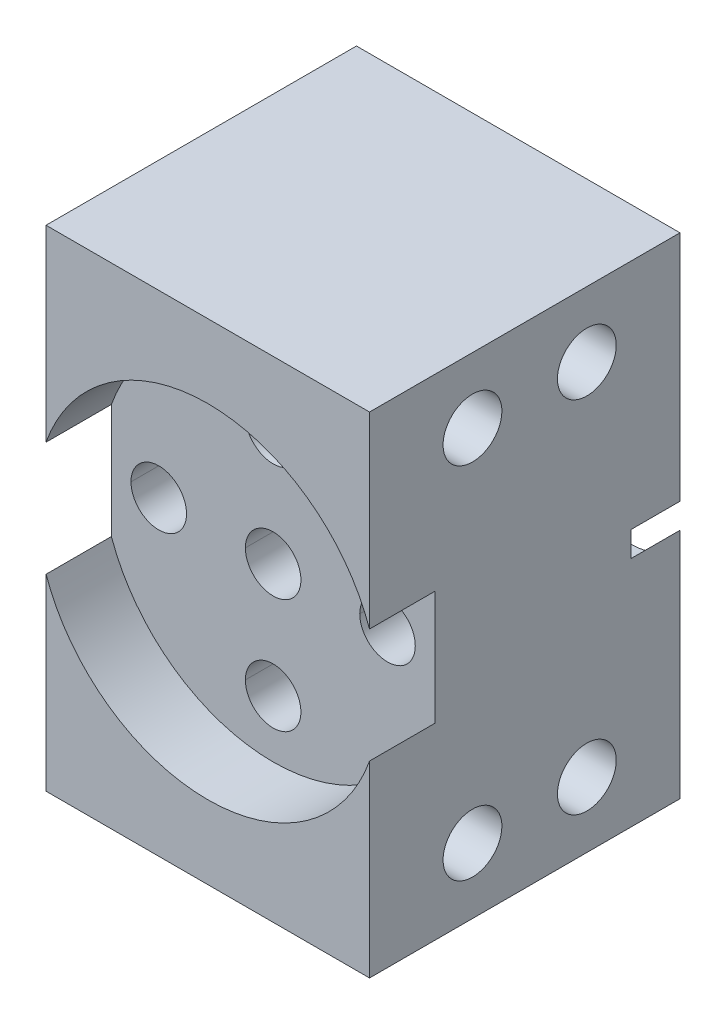
ISO-10303-21;
HEADER;
FILE_DESCRIPTION(('STEP AP214'),'2;1');
FILE_NAME('part.step','',(''),(''),'','','');
FILE_SCHEMA(('AUTOMOTIVE_DESIGN { 1 0 10303 214 1 1 1 1 }'));
ENDSEC;
DATA;
#1=APPLICATION_CONTEXT('core data for automotive mechanical design processes');
#2=APPLICATION_PROTOCOL_DEFINITION('international standard','automotive_design',2000,#1);
#3=PRODUCT_CONTEXT('',#1,'mechanical');
#4=PRODUCT('Part','Part','',(#3));
#5=PRODUCT_RELATED_PRODUCT_CATEGORY('part','',(#4));
#6=PRODUCT_DEFINITION_FORMATION('','',#4);
#7=PRODUCT_DEFINITION_CONTEXT('part definition',#1,'design');
#8=PRODUCT_DEFINITION('design','',#6,#7);
#9=PRODUCT_DEFINITION_SHAPE('','',#8);
#10=(LENGTH_UNIT() NAMED_UNIT(*) SI_UNIT(.MILLI.,.METRE.));
#11=(NAMED_UNIT(*) PLANE_ANGLE_UNIT() SI_UNIT($,.RADIAN.));
#12=(NAMED_UNIT(*) SI_UNIT($,.STERADIAN.) SOLID_ANGLE_UNIT());
#13=UNCERTAINTY_MEASURE_WITH_UNIT(LENGTH_MEASURE(1.E-05),#10,'distance_accuracy_value','');
#14=(GEOMETRIC_REPRESENTATION_CONTEXT(3) GLOBAL_UNCERTAINTY_ASSIGNED_CONTEXT((#13)) GLOBAL_UNIT_ASSIGNED_CONTEXT((#10,
#11,#12)) REPRESENTATION_CONTEXT('',''));
#15=CARTESIAN_POINT('',(0.,0.,0.));
#16=DIRECTION('',(0.,0.,1.));
#17=DIRECTION('',(1.,0.,0.));
#18=AXIS2_PLACEMENT_3D('',#15,#16,#17);
#19=CARTESIAN_POINT('',(-9.9,18.,20.));
#20=DIRECTION('',(1.,0.,0.));
#21=DIRECTION('',(0.,1.,0.));
#22=AXIS2_PLACEMENT_3D('',#19,#20,#21);
#23=PLANE('',#22);
#24=CARTESIAN_POINT('',(-9.9,11.,5.7));
#25=DIRECTION('',(1.,0.,0.));
#26=DIRECTION('',(0.,1.,0.));
#27=AXIS2_PLACEMENT_3D('',#24,#25,#26);
#28=CIRCLE('',#27,1.8);
#29=CARTESIAN_POINT('',(-9.9,12.8,5.7));
#30=VERTEX_POINT('',#29);
#31=EDGE_CURVE('E358',#30,#30,#28,.T.);
#32=ORIENTED_EDGE('',*,*,#31,.T.);
#33=EDGE_LOOP('',(#32));
#34=FACE_BOUND('',#33,.T.);
#35=CARTESIAN_POINT('',(-9.9,-11.,12.7));
#36=DIRECTION('',(1.,0.,0.));
#37=DIRECTION('',(0.,1.,0.));
#38=AXIS2_PLACEMENT_3D('',#35,#36,#37);
#39=CIRCLE('',#38,1.8);
#40=CARTESIAN_POINT('',(-9.9,-9.2,12.7));
#41=VERTEX_POINT('',#40);
#42=EDGE_CURVE('E354',#41,#41,#39,.T.);
#43=ORIENTED_EDGE('',*,*,#42,.T.);
#44=EDGE_LOOP('',(#43));
#45=FACE_BOUND('',#44,.T.);
#46=CARTESIAN_POINT('',(-9.9,-11.,5.7));
#47=DIRECTION('',(1.,0.,0.));
#48=DIRECTION('',(0.,1.,0.));
#49=AXIS2_PLACEMENT_3D('',#46,#47,#48);
#50=CIRCLE('',#49,1.8);
#51=CARTESIAN_POINT('',(-9.9,-9.2,5.7));
#52=VERTEX_POINT('',#51);
#53=EDGE_CURVE('E350',#52,#52,#50,.T.);
#54=ORIENTED_EDGE('',*,*,#53,.T.);
#55=EDGE_LOOP('',(#54));
#56=FACE_BOUND('',#55,.T.);
#57=CARTESIAN_POINT('',(-9.9,11.,12.7));
#58=DIRECTION('',(1.,0.,0.));
#59=DIRECTION('',(0.,1.,0.));
#60=AXIS2_PLACEMENT_3D('',#57,#58,#59);
#61=CIRCLE('',#60,1.8);
#62=CARTESIAN_POINT('',(-9.9,12.8,12.7));
#63=VERTEX_POINT('',#62);
#64=EDGE_CURVE('E346',#63,#63,#61,.T.);
#65=ORIENTED_EDGE('',*,*,#64,.T.);
#66=EDGE_LOOP('',(#65));
#67=FACE_BOUND('',#66,.T.);
#68=DIRECTION('',(0.,0.,1.));
#69=VECTOR('',#68,1.);
#70=CARTESIAN_POINT('',(-9.9,-15.,0.));
#71=LINE('',#70,#69);
#72=CARTESIAN_POINT('',(-9.9,-15.,0.));
#73=VERTEX_POINT('',#72);
#74=CARTESIAN_POINT('',(-9.9,-15.,19.));
#75=VERTEX_POINT('',#74);
#76=EDGE_CURVE('E309',#73,#75,#71,.T.);
#77=ORIENTED_EDGE('',*,*,#76,.T.);
#78=DIRECTION('',(0.,-1.,0.));
#79=VECTOR('',#78,1.);
#80=CARTESIAN_POINT('',(-9.9,18.,19.));
#81=LINE('',#80,#79);
#82=CARTESIAN_POINT('',(-9.9,-3.49857113690718,19.));
#83=VERTEX_POINT('',#82);
#84=EDGE_CURVE('E323',#83,#75,#81,.T.);
#85=ORIENTED_EDGE('',*,*,#84,.F.);
#86=DIRECTION('',(0.,0.,-1.));
#87=VECTOR('',#86,1.);
#88=CARTESIAN_POINT('',(-9.9,-3.49857113690718,15.));
#89=LINE('',#88,#87);
#90=CARTESIAN_POINT('',(-9.9,-3.49857113690718,15.));
#91=VERTEX_POINT('',#90);
#92=EDGE_CURVE('E461',#83,#91,#89,.T.);
#93=ORIENTED_EDGE('',*,*,#92,.T.);
#94=DIRECTION('',(0.,-1.,0.));
#95=VECTOR('',#94,1.);
#96=CARTESIAN_POINT('',(-9.9,18.,15.));
#97=LINE('',#96,#95);
#98=CARTESIAN_POINT('',(-9.9,3.49857113690717,15.));
#99=VERTEX_POINT('',#98);
#100=EDGE_CURVE('E512',#99,#91,#97,.T.);
#101=ORIENTED_EDGE('',*,*,#100,.F.);
#102=DIRECTION('',(0.,0.,1.));
#103=VECTOR('',#102,1.);
#104=CARTESIAN_POINT('',(-9.9,3.49857113690717,15.));
#105=LINE('',#104,#103);
#106=CARTESIAN_POINT('',(-9.9,3.49857113690717,19.));
#107=VERTEX_POINT('',#106);
#108=EDGE_CURVE('E378',#99,#107,#105,.T.);
#109=ORIENTED_EDGE('',*,*,#108,.T.);
#110=CARTESIAN_POINT('',(-9.9,15.,19.));
#111=VERTEX_POINT('',#110);
#112=EDGE_CURVE('E316',#111,#107,#81,.T.);
#113=ORIENTED_EDGE('',*,*,#112,.F.);
#114=DIRECTION('',(0.,0.,-1.));
#115=VECTOR('',#114,1.);
#116=CARTESIAN_POINT('',(-9.9,15.,0.));
#117=LINE('',#116,#115);
#118=CARTESIAN_POINT('',(-9.9,15.,0.));
#119=VERTEX_POINT('',#118);
#120=EDGE_CURVE('E73',#111,#119,#117,.T.);
#121=ORIENTED_EDGE('',*,*,#120,.T.);
#122=DIRECTION('',(0.,-1.,0.));
#123=VECTOR('',#122,1.);
#124=CARTESIAN_POINT('',(-9.9,18.,0.));
#125=LINE('',#124,#123);
#126=CARTESIAN_POINT('',(-9.9,0.768114574786898,0.));
#127=VERTEX_POINT('',#126);
#128=EDGE_CURVE('E390',#119,#127,#125,.T.);
#129=ORIENTED_EDGE('',*,*,#128,.T.);
#130=DIRECTION('',(0.,0.,1.));
#131=VECTOR('',#130,1.);
#132=CARTESIAN_POINT('',(-9.9,0.768114574786898,3.));
#133=LINE('',#132,#131);
#134=CARTESIAN_POINT('',(-9.9,0.768114574786898,3.));
#135=VERTEX_POINT('',#134);
#136=EDGE_CURVE('E373',#127,#135,#133,.T.);
#137=ORIENTED_EDGE('',*,*,#136,.T.);
#138=DIRECTION('',(0.,1.,0.));
#139=VECTOR('',#138,1.);
#140=CARTESIAN_POINT('',(-9.9,18.,3.));
#141=LINE('',#140,#139);
#142=CARTESIAN_POINT('',(-9.9,-0.768114574786849,3.));
#143=VERTEX_POINT('',#142);
#144=EDGE_CURVE('E377',#143,#135,#141,.T.);
#145=ORIENTED_EDGE('',*,*,#144,.F.);
#146=DIRECTION('',(0.,0.,-1.));
#147=VECTOR('',#146,1.);
#148=CARTESIAN_POINT('',(-9.9,-0.768114574786849,3.));
#149=LINE('',#148,#147);
#150=CARTESIAN_POINT('',(-9.9,-0.768114574786849,0.));
#151=VERTEX_POINT('',#150);
#152=EDGE_CURVE('E566',#143,#151,#149,.T.);
#153=ORIENTED_EDGE('',*,*,#152,.T.);
#154=DIRECTION('',(0.,-1.,0.));
#155=VECTOR('',#154,1.);
#156=CARTESIAN_POINT('',(-9.9,18.,0.));
#157=LINE('',#156,#155);
#158=EDGE_CURVE('E581',#151,#73,#157,.T.);
#159=ORIENTED_EDGE('',*,*,#158,.T.);
#160=EDGE_LOOP('',(#77,#85,#93,#101,#109,#113,#121,#129,#137,#145,#153,#159));
#161=FACE_BOUND('',#160,.T.);
#162=ADVANCED_FACE('F55',(#34,#45,#56,#67,#161),#23,.F.);
#163=CARTESIAN_POINT('',(9.9,18.,20.));
#164=DIRECTION('',(-1.,0.,0.));
#165=DIRECTION('',(0.,0.,1.));
#166=AXIS2_PLACEMENT_3D('',#163,#164,#165);
#167=PLANE('',#166);
#168=CARTESIAN_POINT('',(9.9,11.,5.7));
#169=DIRECTION('',(1.,0.,0.));
#170=DIRECTION('',(0.,1.,0.));
#171=AXIS2_PLACEMENT_3D('',#168,#169,#170);
#172=CIRCLE('',#171,1.8);
#173=CARTESIAN_POINT('',(9.9,12.8,5.7));
#174=VERTEX_POINT('',#173);
#175=EDGE_CURVE('E335',#174,#174,#172,.T.);
#176=ORIENTED_EDGE('',*,*,#175,.F.);
#177=EDGE_LOOP('',(#176));
#178=FACE_BOUND('',#177,.T.);
#179=CARTESIAN_POINT('',(9.9,-11.,12.7));
#180=DIRECTION('',(1.,0.,0.));
#181=DIRECTION('',(0.,1.,0.));
#182=AXIS2_PLACEMENT_3D('',#179,#180,#181);
#183=CIRCLE('',#182,1.8);
#184=CARTESIAN_POINT('',(9.9,-9.2,12.7));
#185=VERTEX_POINT('',#184);
#186=EDGE_CURVE('E334',#185,#185,#183,.T.);
#187=ORIENTED_EDGE('',*,*,#186,.F.);
#188=EDGE_LOOP('',(#187));
#189=FACE_BOUND('',#188,.T.);
#190=CARTESIAN_POINT('',(9.9,-11.,5.7));
#191=DIRECTION('',(1.,0.,0.));
#192=DIRECTION('',(0.,1.,0.));
#193=AXIS2_PLACEMENT_3D('',#190,#191,#192);
#194=CIRCLE('',#193,1.8);
#195=CARTESIAN_POINT('',(9.9,-9.2,5.7));
#196=VERTEX_POINT('',#195);
#197=EDGE_CURVE('E330',#196,#196,#194,.T.);
#198=ORIENTED_EDGE('',*,*,#197,.F.);
#199=EDGE_LOOP('',(#198));
#200=FACE_BOUND('',#199,.T.);
#201=CARTESIAN_POINT('',(9.9,11.,12.7));
#202=DIRECTION('',(1.,0.,0.));
#203=DIRECTION('',(0.,1.,0.));
#204=AXIS2_PLACEMENT_3D('',#201,#202,#203);
#205=CIRCLE('',#204,1.8);
#206=CARTESIAN_POINT('',(9.9,12.8,12.7));
#207=VERTEX_POINT('',#206);
#208=EDGE_CURVE('E339',#207,#207,#205,.T.);
#209=ORIENTED_EDGE('',*,*,#208,.F.);
#210=EDGE_LOOP('',(#209));
#211=FACE_BOUND('',#210,.T.);
#212=DIRECTION('',(0.,0.,1.));
#213=VECTOR('',#212,1.);
#214=CARTESIAN_POINT('',(9.9,-15.,0.));
#215=LINE('',#214,#213);
#216=CARTESIAN_POINT('',(9.9,-15.,0.));
#217=VERTEX_POINT('',#216);
#218=CARTESIAN_POINT('',(9.9,-15.,19.));
#219=VERTEX_POINT('',#218);
#220=EDGE_CURVE('E81',#217,#219,#215,.T.);
#221=ORIENTED_EDGE('',*,*,#220,.F.);
#222=DIRECTION('',(0.,1.,0.));
#223=VECTOR('',#222,1.);
#224=CARTESIAN_POINT('',(9.9,18.,0.));
#225=LINE('',#224,#223);
#226=CARTESIAN_POINT('',(9.9,-0.768114574786941,0.));
#227=VERTEX_POINT('',#226);
#228=EDGE_CURVE('E485',#217,#227,#225,.T.);
#229=ORIENTED_EDGE('',*,*,#228,.T.);
#230=DIRECTION('',(0.,0.,1.));
#231=VECTOR('',#230,1.);
#232=CARTESIAN_POINT('',(9.9,-0.768114574786944,3.));
#233=LINE('',#232,#231);
#234=CARTESIAN_POINT('',(9.9,-0.768114574786941,3.));
#235=VERTEX_POINT('',#234);
#236=EDGE_CURVE('E423',#227,#235,#233,.T.);
#237=ORIENTED_EDGE('',*,*,#236,.T.);
#238=DIRECTION('',(0.,-1.,0.));
#239=VECTOR('',#238,1.);
#240=CARTESIAN_POINT('',(9.9,18.,3.));
#241=LINE('',#240,#239);
#242=CARTESIAN_POINT('',(9.9,0.768114574786793,3.));
#243=VERTEX_POINT('',#242);
#244=EDGE_CURVE('E427',#243,#235,#241,.T.);
#245=ORIENTED_EDGE('',*,*,#244,.F.);
#246=DIRECTION('',(0.,0.,-1.));
#247=VECTOR('',#246,1.);
#248=CARTESIAN_POINT('',(9.9,0.768114574786797,3.));
#249=LINE('',#248,#247);
#250=CARTESIAN_POINT('',(9.9,0.768114574786793,0.));
#251=VERTEX_POINT('',#250);
#252=EDGE_CURVE('E465',#243,#251,#249,.T.);
#253=ORIENTED_EDGE('',*,*,#252,.T.);
#254=DIRECTION('',(0.,1.,0.));
#255=VECTOR('',#254,1.);
#256=CARTESIAN_POINT('',(9.9,18.,0.));
#257=LINE('',#256,#255);
#258=CARTESIAN_POINT('',(9.9,15.,0.));
#259=VERTEX_POINT('',#258);
#260=EDGE_CURVE('E308',#251,#259,#257,.T.);
#261=ORIENTED_EDGE('',*,*,#260,.T.);
#262=DIRECTION('',(0.,0.,-1.));
#263=VECTOR('',#262,1.);
#264=CARTESIAN_POINT('',(9.9,15.,0.));
#265=LINE('',#264,#263);
#266=CARTESIAN_POINT('',(9.9,15.,19.));
#267=VERTEX_POINT('',#266);
#268=EDGE_CURVE('E294',#267,#259,#265,.T.);
#269=ORIENTED_EDGE('',*,*,#268,.F.);
#270=DIRECTION('',(0.,1.,0.));
#271=VECTOR('',#270,1.);
#272=CARTESIAN_POINT('',(9.9,18.,19.));
#273=LINE('',#272,#271);
#274=CARTESIAN_POINT('',(9.9,3.49857113690719,19.));
#275=VERTEX_POINT('',#274);
#276=EDGE_CURVE('E305',#275,#267,#273,.T.);
#277=ORIENTED_EDGE('',*,*,#276,.F.);
#278=DIRECTION('',(0.,0.,-1.));
#279=VECTOR('',#278,1.);
#280=CARTESIAN_POINT('',(9.9,3.49857113690719,15.));
#281=LINE('',#280,#279);
#282=CARTESIAN_POINT('',(9.9,3.49857113690719,15.));
#283=VERTEX_POINT('',#282);
#284=EDGE_CURVE('E509',#275,#283,#281,.T.);
#285=ORIENTED_EDGE('',*,*,#284,.T.);
#286=DIRECTION('',(0.,1.,0.));
#287=VECTOR('',#286,1.);
#288=CARTESIAN_POINT('',(9.9,18.,15.));
#289=LINE('',#288,#287);
#290=CARTESIAN_POINT('',(9.9,-3.4985711369072,15.));
#291=VERTEX_POINT('',#290);
#292=EDGE_CURVE('E575',#291,#283,#289,.T.);
#293=ORIENTED_EDGE('',*,*,#292,.F.);
#294=DIRECTION('',(0.,0.,1.));
#295=VECTOR('',#294,1.);
#296=CARTESIAN_POINT('',(9.9,-3.4985711369072,15.));
#297=LINE('',#296,#295);
#298=CARTESIAN_POINT('',(9.9,-3.4985711369072,19.));
#299=VERTEX_POINT('',#298);
#300=EDGE_CURVE('E428',#291,#299,#297,.T.);
#301=ORIENTED_EDGE('',*,*,#300,.T.);
#302=EDGE_CURVE('E315',#219,#299,#273,.T.);
#303=ORIENTED_EDGE('',*,*,#302,.F.);
#304=EDGE_LOOP('',(#221,#229,#237,#245,#253,#261,#269,#277,#285,#293,#301,#303));
#305=FACE_BOUND('',#304,.T.);
#306=ADVANCED_FACE('F304',(#178,#189,#200,#211,#305),#167,.F.);
#307=CARTESIAN_POINT('',(0.,0.,0.));
#308=DIRECTION('',(0.,0.,1.));
#309=DIRECTION('',(1.,0.,0.));
#310=AXIS2_PLACEMENT_3D('',#307,#308,#309);
#311=PLANE('',#310);
#312=CARTESIAN_POINT('',(0.,0.,0.));
#313=DIRECTION('',(0.,0.,-1.));
#314=DIRECTION('',(-1.,0.,0.));
#315=AXIS2_PLACEMENT_3D('',#312,#313,#314);
#316=CIRCLE('',#315,3.);
#317=CARTESIAN_POINT('',(-3.,0.,0.));
#318=VERTEX_POINT('',#317);
#319=CARTESIAN_POINT('',(3.,0.,0.));
#320=VERTEX_POINT('',#319);
#321=EDGE_CURVE('E596',#318,#320,#316,.T.);
#322=ORIENTED_EDGE('',*,*,#321,.F.);
#323=CARTESIAN_POINT('',(0.,0.,0.));
#324=DIRECTION('',(0.,0.,-1.));
#325=DIRECTION('',(-1.,0.,0.));
#326=AXIS2_PLACEMENT_3D('',#323,#324,#325);
#327=CIRCLE('',#326,3.);
#328=EDGE_CURVE('E408',#320,#318,#327,.T.);
#329=ORIENTED_EDGE('',*,*,#328,.F.);
#330=EDGE_LOOP('',(#322,#329));
#331=FACE_BOUND('',#330,.T.);
#332=CARTESIAN_POINT('',(0.,7.,0.));
#333=DIRECTION('',(0.,0.,-1.));
#334=DIRECTION('',(-1.,0.,0.));
#335=AXIS2_PLACEMENT_3D('',#332,#333,#334);
#336=CIRCLE('',#335,3.);
#337=CARTESIAN_POINT('',(-2.99999999999995,7.,0.));
#338=VERTEX_POINT('',#337);
#339=CARTESIAN_POINT('',(3.00000000000005,7.,0.));
#340=VERTEX_POINT('',#339);
#341=EDGE_CURVE('E588',#338,#340,#336,.T.);
#342=ORIENTED_EDGE('',*,*,#341,.F.);
#343=CARTESIAN_POINT('',(0.,7.,0.));
#344=DIRECTION('',(0.,0.,-1.));
#345=DIRECTION('',(-1.,0.,0.));
#346=AXIS2_PLACEMENT_3D('',#343,#344,#345);
#347=CIRCLE('',#346,3.);
#348=EDGE_CURVE('E414',#340,#338,#347,.T.);
#349=ORIENTED_EDGE('',*,*,#348,.F.);
#350=EDGE_LOOP('',(#342,#349));
#351=FACE_BOUND('',#350,.T.);
#352=CARTESIAN_POINT('',(0.,-7.,0.));
#353=DIRECTION('',(0.,0.,-1.));
#354=DIRECTION('',(-1.,0.,0.));
#355=AXIS2_PLACEMENT_3D('',#352,#353,#354);
#356=CIRCLE('',#355,3.);
#357=CARTESIAN_POINT('',(-3.,-7.,0.));
#358=VERTEX_POINT('',#357);
#359=CARTESIAN_POINT('',(3.,-7.,0.));
#360=VERTEX_POINT('',#359);
#361=EDGE_CURVE('E488',#358,#360,#356,.T.);
#362=ORIENTED_EDGE('',*,*,#361,.F.);
#363=CARTESIAN_POINT('',(0.,-7.,0.));
#364=DIRECTION('',(0.,0.,-1.));
#365=DIRECTION('',(-1.,0.,0.));
#366=AXIS2_PLACEMENT_3D('',#363,#364,#365);
#367=CIRCLE('',#366,3.);
#368=EDGE_CURVE('E436',#360,#358,#367,.T.);
#369=ORIENTED_EDGE('',*,*,#368,.F.);
#370=EDGE_LOOP('',(#362,#369));
#371=FACE_BOUND('',#370,.T.);
#372=DIRECTION('',(-1.,0.,0.));
#373=VECTOR('',#372,1.);
#374=CARTESIAN_POINT('',(9.9,-15.,0.));
#375=LINE('',#374,#373);
#376=EDGE_CURVE('E641',#217,#73,#375,.T.);
#377=ORIENTED_EDGE('',*,*,#376,.T.);
#378=ORIENTED_EDGE('',*,*,#158,.F.);
#379=CARTESIAN_POINT('',(-7.,0.,0.));
#380=DIRECTION('',(0.,0.,-1.));
#381=DIRECTION('',(-1.,0.,0.));
#382=AXIS2_PLACEMENT_3D('',#379,#380,#381);
#383=CIRCLE('',#382,3.);
#384=EDGE_CURVE('E585',#127,#151,#383,.T.);
#385=ORIENTED_EDGE('',*,*,#384,.F.);
#386=ORIENTED_EDGE('',*,*,#128,.F.);
#387=DIRECTION('',(-1.,0.,0.));
#388=VECTOR('',#387,1.);
#389=CARTESIAN_POINT('',(9.9,15.,0.));
#390=LINE('',#389,#388);
#391=EDGE_CURVE('E299',#259,#119,#390,.T.);
#392=ORIENTED_EDGE('',*,*,#391,.F.);
#393=ORIENTED_EDGE('',*,*,#260,.F.);
#394=CARTESIAN_POINT('',(7.,0.,0.));
#395=DIRECTION('',(0.,0.,-1.));
#396=DIRECTION('',(-1.,0.,0.));
#397=AXIS2_PLACEMENT_3D('',#394,#395,#396);
#398=CIRCLE('',#397,3.);
#399=CARTESIAN_POINT('',(4.,0.,0.));
#400=VERTEX_POINT('',#399);
#401=EDGE_CURVE('E456',#400,#251,#398,.T.);
#402=ORIENTED_EDGE('',*,*,#401,.F.);
#403=CARTESIAN_POINT('',(7.,0.,0.));
#404=DIRECTION('',(0.,0.,-1.));
#405=DIRECTION('',(-1.,0.,0.));
#406=AXIS2_PLACEMENT_3D('',#403,#404,#405);
#407=CIRCLE('',#406,3.);
#408=EDGE_CURVE('E389',#227,#400,#407,.T.);
#409=ORIENTED_EDGE('',*,*,#408,.F.);
#410=ORIENTED_EDGE('',*,*,#228,.F.);
#411=EDGE_LOOP('',(#377,#378,#385,#386,#392,#393,#402,#409,#410));
#412=FACE_BOUND('',#411,.T.);
#413=ADVANCED_FACE('F630',(#331,#351,#371,#412),#311,.F.);
#414=CARTESIAN_POINT('',(0.,0.,19.));
#415=DIRECTION('',(0.,0.,1.));
#416=DIRECTION('',(1.,0.,0.));
#417=AXIS2_PLACEMENT_3D('',#414,#415,#416);
#418=PLANE('',#417);
#419=ORIENTED_EDGE('',*,*,#276,.T.);
#420=DIRECTION('',(-1.,0.,0.));
#421=VECTOR('',#420,1.);
#422=CARTESIAN_POINT('',(9.9,15.,19.));
#423=LINE('',#422,#421);
#424=EDGE_CURVE('E291',#267,#111,#423,.T.);
#425=ORIENTED_EDGE('',*,*,#424,.T.);
#426=ORIENTED_EDGE('',*,*,#112,.T.);
#427=CARTESIAN_POINT('',(0.,0.,19.));
#428=DIRECTION('',(0.,0.,1.));
#429=DIRECTION('',(1.,0.,0.));
#430=AXIS2_PLACEMENT_3D('',#427,#428,#429);
#431=CIRCLE('',#430,10.5);
#432=EDGE_CURVE('E313',#107,#275,#431,.F.);
#433=ORIENTED_EDGE('',*,*,#432,.T.);
#434=EDGE_LOOP('',(#419,#425,#426,#433));
#435=FACE_BOUND('',#434,.T.);
#436=ADVANCED_FACE('F311',(#435),#418,.T.);
#437=ORIENTED_EDGE('',*,*,#84,.T.);
#438=DIRECTION('',(-1.,0.,0.));
#439=VECTOR('',#438,1.);
#440=CARTESIAN_POINT('',(9.9,-15.,19.));
#441=LINE('',#440,#439);
#442=EDGE_CURVE('E644',#219,#75,#441,.T.);
#443=ORIENTED_EDGE('',*,*,#442,.F.);
#444=ORIENTED_EDGE('',*,*,#302,.T.);
#445=CARTESIAN_POINT('',(0.,0.,19.));
#446=DIRECTION('',(0.,0.,1.));
#447=DIRECTION('',(1.,0.,0.));
#448=AXIS2_PLACEMENT_3D('',#445,#446,#447);
#449=CIRCLE('',#448,10.5);
#450=EDGE_CURVE('E321',#299,#83,#449,.F.);
#451=ORIENTED_EDGE('',*,*,#450,.T.);
#452=EDGE_LOOP('',(#437,#443,#444,#451));
#453=FACE_BOUND('',#452,.T.);
#454=ADVANCED_FACE('F663',(#453),#418,.T.);
#455=CARTESIAN_POINT('',(0.,0.,15.));
#456=DIRECTION('',(0.,0.,1.));
#457=DIRECTION('',(1.,0.,0.));
#458=AXIS2_PLACEMENT_3D('',#455,#456,#457);
#459=CYLINDRICAL_SURFACE('',#458,10.5);
#460=ORIENTED_EDGE('',*,*,#432,.F.);
#461=ORIENTED_EDGE('',*,*,#108,.F.);
#462=CARTESIAN_POINT('',(0.,0.,15.));
#463=DIRECTION('',(0.,0.,1.));
#464=DIRECTION('',(1.,0.,0.));
#465=AXIS2_PLACEMENT_3D('',#462,#463,#464);
#466=CIRCLE('',#465,10.5);
#467=EDGE_CURVE('E11',#283,#99,#466,.T.);
#468=ORIENTED_EDGE('',*,*,#467,.F.);
#469=ORIENTED_EDGE('',*,*,#284,.F.);
#470=EDGE_LOOP('',(#460,#461,#468,#469));
#471=FACE_BOUND('',#470,.T.);
#472=ADVANCED_FACE('F57',(#471),#459,.F.);
#473=CARTESIAN_POINT('',(0.,0.,15.));
#474=DIRECTION('',(0.,0.,1.));
#475=DIRECTION('',(1.,0.,0.));
#476=AXIS2_PLACEMENT_3D('',#473,#474,#475);
#477=CYLINDRICAL_SURFACE('',#476,10.5);
#478=ORIENTED_EDGE('',*,*,#450,.F.);
#479=ORIENTED_EDGE('',*,*,#300,.F.);
#480=CARTESIAN_POINT('',(0.,0.,15.));
#481=DIRECTION('',(0.,0.,1.));
#482=DIRECTION('',(1.,0.,0.));
#483=AXIS2_PLACEMENT_3D('',#480,#481,#482);
#484=CIRCLE('',#483,10.5);
#485=EDGE_CURVE('E65',#91,#291,#484,.T.);
#486=ORIENTED_EDGE('',*,*,#485,.F.);
#487=ORIENTED_EDGE('',*,*,#92,.F.);
#488=EDGE_LOOP('',(#478,#479,#486,#487));
#489=FACE_BOUND('',#488,.T.);
#490=ADVANCED_FACE('F670',(#489),#477,.F.);
#491=CARTESIAN_POINT('',(0.,0.,15.));
#492=DIRECTION('',(0.,0.,1.));
#493=DIRECTION('',(1.,0.,0.));
#494=AXIS2_PLACEMENT_3D('',#491,#492,#493);
#495=PLANE('',#494);
#496=CARTESIAN_POINT('',(7.,0.,15.));
#497=DIRECTION('',(0.,0.,1.));
#498=DIRECTION('',(1.,0.,0.));
#499=AXIS2_PLACEMENT_3D('',#496,#497,#498);
#500=CIRCLE('',#499,1.7);
#501=CARTESIAN_POINT('',(5.3,0.,15.));
#502=VERTEX_POINT('',#501);
#503=CARTESIAN_POINT('',(8.7,0.,15.));
#504=VERTEX_POINT('',#503);
#505=EDGE_CURVE('E474',#502,#504,#500,.T.);
#506=ORIENTED_EDGE('',*,*,#505,.F.);
#507=CARTESIAN_POINT('',(7.,0.,15.));
#508=DIRECTION('',(0.,0.,1.));
#509=DIRECTION('',(1.,0.,0.));
#510=AXIS2_PLACEMENT_3D('',#507,#508,#509);
#511=CIRCLE('',#510,1.7);
#512=EDGE_CURVE('E571',#504,#502,#511,.T.);
#513=ORIENTED_EDGE('',*,*,#512,.F.);
#514=EDGE_LOOP('',(#506,#513));
#515=FACE_BOUND('',#514,.T.);
#516=CARTESIAN_POINT('',(0.,7.,15.));
#517=DIRECTION('',(0.,0.,1.));
#518=DIRECTION('',(1.,0.,0.));
#519=AXIS2_PLACEMENT_3D('',#516,#517,#518);
#520=CIRCLE('',#519,1.7);
#521=CARTESIAN_POINT('',(-1.69999999999995,7.,15.));
#522=VERTEX_POINT('',#521);
#523=CARTESIAN_POINT('',(1.70000000000005,7.,15.));
#524=VERTEX_POINT('',#523);
#525=EDGE_CURVE('E479',#522,#524,#520,.T.);
#526=ORIENTED_EDGE('',*,*,#525,.F.);
#527=CARTESIAN_POINT('',(0.,7.,15.));
#528=DIRECTION('',(0.,0.,1.));
#529=DIRECTION('',(1.,0.,0.));
#530=AXIS2_PLACEMENT_3D('',#527,#528,#529);
#531=CIRCLE('',#530,1.7);
#532=EDGE_CURVE('E391',#524,#522,#531,.T.);
#533=ORIENTED_EDGE('',*,*,#532,.F.);
#534=EDGE_LOOP('',(#526,#533));
#535=FACE_BOUND('',#534,.T.);
#536=CARTESIAN_POINT('',(-7.,0.,15.));
#537=DIRECTION('',(0.,0.,1.));
#538=DIRECTION('',(1.,0.,0.));
#539=AXIS2_PLACEMENT_3D('',#536,#537,#538);
#540=CIRCLE('',#539,1.7);
#541=CARTESIAN_POINT('',(-8.7,0.,15.));
#542=VERTEX_POINT('',#541);
#543=CARTESIAN_POINT('',(-5.3,0.,15.));
#544=VERTEX_POINT('',#543);
#545=EDGE_CURVE('E523',#542,#544,#540,.T.);
#546=ORIENTED_EDGE('',*,*,#545,.F.);
#547=CARTESIAN_POINT('',(-7.,0.,15.));
#548=DIRECTION('',(0.,0.,1.));
#549=DIRECTION('',(1.,0.,0.));
#550=AXIS2_PLACEMENT_3D('',#547,#548,#549);
#551=CIRCLE('',#550,1.7);
#552=EDGE_CURVE('E399',#544,#542,#551,.T.);
#553=ORIENTED_EDGE('',*,*,#552,.F.);
#554=EDGE_LOOP('',(#546,#553));
#555=FACE_BOUND('',#554,.T.);
#556=CARTESIAN_POINT('',(0.,-7.,15.));
#557=DIRECTION('',(0.,0.,1.));
#558=DIRECTION('',(1.,0.,0.));
#559=AXIS2_PLACEMENT_3D('',#556,#557,#558);
#560=CIRCLE('',#559,1.7);
#561=CARTESIAN_POINT('',(-1.7,-7.,15.));
#562=VERTEX_POINT('',#561);
#563=CARTESIAN_POINT('',(1.7,-7.,15.));
#564=VERTEX_POINT('',#563);
#565=EDGE_CURVE('E367',#562,#564,#560,.T.);
#566=ORIENTED_EDGE('',*,*,#565,.F.);
#567=CARTESIAN_POINT('',(0.,-7.,15.));
#568=DIRECTION('',(0.,0.,1.));
#569=DIRECTION('',(1.,0.,0.));
#570=AXIS2_PLACEMENT_3D('',#567,#568,#569);
#571=CIRCLE('',#570,1.7);
#572=EDGE_CURVE('E400',#564,#562,#571,.T.);
#573=ORIENTED_EDGE('',*,*,#572,.F.);
#574=EDGE_LOOP('',(#566,#573));
#575=FACE_BOUND('',#574,.T.);
#576=CARTESIAN_POINT('',(0.,0.,15.));
#577=DIRECTION('',(0.,0.,1.));
#578=DIRECTION('',(1.,0.,0.));
#579=AXIS2_PLACEMENT_3D('',#576,#577,#578);
#580=CIRCLE('',#579,1.7);
#581=CARTESIAN_POINT('',(-1.7,0.,15.));
#582=VERTEX_POINT('',#581);
#583=CARTESIAN_POINT('',(1.7,0.,15.));
#584=VERTEX_POINT('',#583);
#585=EDGE_CURVE('E502',#582,#584,#580,.T.);
#586=ORIENTED_EDGE('',*,*,#585,.F.);
#587=CARTESIAN_POINT('',(0.,0.,15.));
#588=DIRECTION('',(0.,0.,1.));
#589=DIRECTION('',(1.,0.,0.));
#590=AXIS2_PLACEMENT_3D('',#587,#588,#589);
#591=CIRCLE('',#590,1.7);
#592=EDGE_CURVE('E516',#584,#582,#591,.T.);
#593=ORIENTED_EDGE('',*,*,#592,.F.);
#594=EDGE_LOOP('',(#586,#593));
#595=FACE_BOUND('',#594,.T.);
#596=ORIENTED_EDGE('',*,*,#292,.T.);
#597=ORIENTED_EDGE('',*,*,#467,.T.);
#598=ORIENTED_EDGE('',*,*,#100,.T.);
#599=ORIENTED_EDGE('',*,*,#485,.T.);
#600=EDGE_LOOP('',(#596,#597,#598,#599));
#601=FACE_BOUND('',#600,.T.);
#602=ADVANCED_FACE('F674',(#515,#535,#555,#575,#595,#601),#495,.T.);
#603=CARTESIAN_POINT('',(0.,0.,3.));
#604=DIRECTION('',(0.,0.,-1.));
#605=DIRECTION('',(0.,-1.,0.));
#606=AXIS2_PLACEMENT_3D('',#603,#604,#605);
#607=PLANE('',#606);
#608=CARTESIAN_POINT('',(0.,0.,3.));
#609=DIRECTION('',(0.,0.,-1.));
#610=DIRECTION('',(-1.,0.,0.));
#611=AXIS2_PLACEMENT_3D('',#608,#609,#610);
#612=CIRCLE('',#611,1.7);
#613=CARTESIAN_POINT('',(-1.7,0.,3.));
#614=VERTEX_POINT('',#613);
#615=CARTESIAN_POINT('',(1.7,0.,3.));
#616=VERTEX_POINT('',#615);
#617=EDGE_CURVE('E513',#614,#616,#612,.T.);
#618=ORIENTED_EDGE('',*,*,#617,.F.);
#619=CARTESIAN_POINT('',(0.,0.,3.));
#620=DIRECTION('',(0.,0.,-1.));
#621=DIRECTION('',(-1.,0.,0.));
#622=AXIS2_PLACEMENT_3D('',#619,#620,#621);
#623=CIRCLE('',#622,1.7);
#624=EDGE_CURVE('E542',#616,#614,#623,.T.);
#625=ORIENTED_EDGE('',*,*,#624,.F.);
#626=EDGE_LOOP('',(#618,#625));
#627=FACE_BOUND('',#626,.T.);
#628=CARTESIAN_POINT('',(0.,0.,3.));
#629=DIRECTION('',(0.,0.,-1.));
#630=DIRECTION('',(-1.,0.,0.));
#631=AXIS2_PLACEMENT_3D('',#628,#629,#630);
#632=CIRCLE('',#631,3.);
#633=CARTESIAN_POINT('',(-3.,0.,3.));
#634=VERTEX_POINT('',#633);
#635=CARTESIAN_POINT('',(3.,0.,3.));
#636=VERTEX_POINT('',#635);
#637=EDGE_CURVE('E59',#634,#636,#632,.T.);
#638=ORIENTED_EDGE('',*,*,#637,.T.);
#639=CARTESIAN_POINT('',(0.,0.,3.));
#640=DIRECTION('',(0.,0.,-1.));
#641=DIRECTION('',(-1.,0.,0.));
#642=AXIS2_PLACEMENT_3D('',#639,#640,#641);
#643=CIRCLE('',#642,3.);
#644=EDGE_CURVE('E362',#636,#634,#643,.T.);
#645=ORIENTED_EDGE('',*,*,#644,.T.);
#646=EDGE_LOOP('',(#638,#645));
#647=FACE_BOUND('',#646,.T.);
#648=ADVANCED_FACE('F621',(#627,#647),#607,.T.);
#649=CARTESIAN_POINT('',(0.,0.,3.));
#650=DIRECTION('',(0.,0.,-1.));
#651=DIRECTION('',(-1.,0.,0.));
#652=AXIS2_PLACEMENT_3D('',#649,#650,#651);
#653=CYLINDRICAL_SURFACE('',#652,3.);
#654=DIRECTION('',(0.,0.,-1.));
#655=VECTOR('',#654,1.);
#656=CARTESIAN_POINT('',(3.,0.,3.));
#657=LINE('',#656,#655);
#658=EDGE_CURVE('E404',#636,#320,#657,.T.);
#659=ORIENTED_EDGE('',*,*,#658,.F.);
#660=ORIENTED_EDGE('',*,*,#637,.F.);
#661=DIRECTION('',(0.,0.,-1.));
#662=VECTOR('',#661,1.);
#663=CARTESIAN_POINT('',(-3.,0.,3.));
#664=LINE('',#663,#662);
#665=EDGE_CURVE('E418',#634,#318,#664,.T.);
#666=ORIENTED_EDGE('',*,*,#665,.T.);
#667=ORIENTED_EDGE('',*,*,#321,.T.);
#668=EDGE_LOOP('',(#659,#660,#666,#667));
#669=FACE_BOUND('',#668,.T.);
#670=ADVANCED_FACE('F625',(#669),#653,.F.);
#671=CARTESIAN_POINT('',(0.,-7.,3.));
#672=DIRECTION('',(0.,0.,-1.));
#673=DIRECTION('',(0.,-1.,0.));
#674=AXIS2_PLACEMENT_3D('',#671,#672,#673);
#675=PLANE('',#674);
#676=CARTESIAN_POINT('',(0.,-7.,3.));
#677=DIRECTION('',(0.,0.,-1.));
#678=DIRECTION('',(-1.,0.,0.));
#679=AXIS2_PLACEMENT_3D('',#676,#677,#678);
#680=CIRCLE('',#679,1.7);
#681=CARTESIAN_POINT('',(-1.7,-7.,3.));
#682=VERTEX_POINT('',#681);
#683=CARTESIAN_POINT('',(1.7,-7.,3.));
#684=VERTEX_POINT('',#683);
#685=EDGE_CURVE('E396',#682,#684,#680,.T.);
#686=ORIENTED_EDGE('',*,*,#685,.F.);
#687=CARTESIAN_POINT('',(0.,-7.,3.));
#688=DIRECTION('',(0.,0.,-1.));
#689=DIRECTION('',(-1.,0.,0.));
#690=AXIS2_PLACEMENT_3D('',#687,#688,#689);
#691=CIRCLE('',#690,1.7);
#692=EDGE_CURVE('E494',#684,#682,#691,.T.);
#693=ORIENTED_EDGE('',*,*,#692,.F.);
#694=EDGE_LOOP('',(#686,#693));
#695=FACE_BOUND('',#694,.T.);
#696=CARTESIAN_POINT('',(0.,-7.,3.));
#697=DIRECTION('',(0.,0.,-1.));
#698=DIRECTION('',(-1.,0.,0.));
#699=AXIS2_PLACEMENT_3D('',#696,#697,#698);
#700=CIRCLE('',#699,3.);
#701=CARTESIAN_POINT('',(-3.,-7.,3.));
#702=VERTEX_POINT('',#701);
#703=CARTESIAN_POINT('',(3.,-7.,3.));
#704=VERTEX_POINT('',#703);
#705=EDGE_CURVE('E612',#702,#704,#700,.T.);
#706=ORIENTED_EDGE('',*,*,#705,.T.);
#707=CARTESIAN_POINT('',(0.,-7.,3.));
#708=DIRECTION('',(0.,0.,-1.));
#709=DIRECTION('',(-1.,0.,0.));
#710=AXIS2_PLACEMENT_3D('',#707,#708,#709);
#711=CIRCLE('',#710,3.);
#712=EDGE_CURVE('E422',#704,#702,#711,.T.);
#713=ORIENTED_EDGE('',*,*,#712,.T.);
#714=EDGE_LOOP('',(#706,#713));
#715=FACE_BOUND('',#714,.T.);
#716=ADVANCED_FACE('F986',(#695,#715),#675,.T.);
#717=CARTESIAN_POINT('',(0.,-7.,3.));
#718=DIRECTION('',(0.,0.,-1.));
#719=DIRECTION('',(-1.,0.,0.));
#720=AXIS2_PLACEMENT_3D('',#717,#718,#719);
#721=CYLINDRICAL_SURFACE('',#720,3.);
#722=DIRECTION('',(0.,0.,-1.));
#723=VECTOR('',#722,1.);
#724=CARTESIAN_POINT('',(3.,-7.,3.));
#725=LINE('',#724,#723);
#726=EDGE_CURVE('E432',#704,#360,#725,.T.);
#727=ORIENTED_EDGE('',*,*,#726,.F.);
#728=ORIENTED_EDGE('',*,*,#705,.F.);
#729=DIRECTION('',(0.,0.,-1.));
#730=VECTOR('',#729,1.);
#731=CARTESIAN_POINT('',(-3.,-7.,3.));
#732=LINE('',#731,#730);
#733=EDGE_CURVE('E383',#702,#358,#732,.T.);
#734=ORIENTED_EDGE('',*,*,#733,.T.);
#735=ORIENTED_EDGE('',*,*,#361,.T.);
#736=EDGE_LOOP('',(#727,#728,#734,#735));
#737=FACE_BOUND('',#736,.T.);
#738=ADVANCED_FACE('F995',(#737),#721,.F.);
#739=CARTESIAN_POINT('',(-7.,0.,3.));
#740=DIRECTION('',(0.,0.,-1.));
#741=DIRECTION('',(0.,-1.,0.));
#742=AXIS2_PLACEMENT_3D('',#739,#740,#741);
#743=PLANE('',#742);
#744=CARTESIAN_POINT('',(-7.,0.,3.));
#745=DIRECTION('',(0.,0.,-1.));
#746=DIRECTION('',(-1.,0.,0.));
#747=AXIS2_PLACEMENT_3D('',#744,#745,#746);
#748=CIRCLE('',#747,1.7);
#749=CARTESIAN_POINT('',(-8.7,0.,3.));
#750=VERTEX_POINT('',#749);
#751=CARTESIAN_POINT('',(-5.3,0.,3.));
#752=VERTEX_POINT('',#751);
#753=EDGE_CURVE('E395',#750,#752,#748,.T.);
#754=ORIENTED_EDGE('',*,*,#753,.F.);
#755=CARTESIAN_POINT('',(-7.,0.,3.));
#756=DIRECTION('',(0.,0.,-1.));
#757=DIRECTION('',(-1.,0.,0.));
#758=AXIS2_PLACEMENT_3D('',#755,#756,#757);
#759=CIRCLE('',#758,1.7);
#760=EDGE_CURVE('E368',#752,#750,#759,.T.);
#761=ORIENTED_EDGE('',*,*,#760,.F.);
#762=EDGE_LOOP('',(#754,#761));
#763=FACE_BOUND('',#762,.T.);
#764=ORIENTED_EDGE('',*,*,#144,.T.);
#765=CARTESIAN_POINT('',(-7.,0.,3.));
#766=DIRECTION('',(0.,0.,-1.));
#767=DIRECTION('',(-1.,0.,0.));
#768=AXIS2_PLACEMENT_3D('',#765,#766,#767);
#769=CIRCLE('',#768,3.);
#770=EDGE_CURVE('E549',#135,#143,#769,.T.);
#771=ORIENTED_EDGE('',*,*,#770,.T.);
#772=EDGE_LOOP('',(#764,#771));
#773=FACE_BOUND('',#772,.T.);
#774=ADVANCED_FACE('F1014',(#763,#773),#743,.T.);
#775=CARTESIAN_POINT('',(-7.,0.,3.));
#776=DIRECTION('',(0.,0.,-1.));
#777=DIRECTION('',(-1.,0.,0.));
#778=AXIS2_PLACEMENT_3D('',#775,#776,#777);
#779=CYLINDRICAL_SURFACE('',#778,3.);
#780=ORIENTED_EDGE('',*,*,#770,.F.);
#781=ORIENTED_EDGE('',*,*,#136,.F.);
#782=ORIENTED_EDGE('',*,*,#384,.T.);
#783=ORIENTED_EDGE('',*,*,#152,.F.);
#784=EDGE_LOOP('',(#780,#781,#782,#783));
#785=FACE_BOUND('',#784,.T.);
#786=ADVANCED_FACE('F654',(#785),#779,.F.);
#787=CARTESIAN_POINT('',(0.,7.,3.));
#788=DIRECTION('',(0.,0.,-1.));
#789=DIRECTION('',(0.,-1.,0.));
#790=AXIS2_PLACEMENT_3D('',#787,#788,#789);
#791=PLANE('',#790);
#792=CARTESIAN_POINT('',(0.,7.,3.));
#793=DIRECTION('',(0.,0.,-1.));
#794=DIRECTION('',(-1.,0.,0.));
#795=AXIS2_PLACEMENT_3D('',#792,#793,#794);
#796=CIRCLE('',#795,1.7);
#797=CARTESIAN_POINT('',(-1.69999999999995,7.,3.));
#798=VERTEX_POINT('',#797);
#799=CARTESIAN_POINT('',(1.70000000000005,7.,3.));
#800=VERTEX_POINT('',#799);
#801=EDGE_CURVE('E394',#798,#800,#796,.T.);
#802=ORIENTED_EDGE('',*,*,#801,.F.);
#803=CARTESIAN_POINT('',(0.,7.,3.));
#804=DIRECTION('',(0.,0.,-1.));
#805=DIRECTION('',(-1.,0.,0.));
#806=AXIS2_PLACEMENT_3D('',#803,#804,#805);
#807=CIRCLE('',#806,1.7);
#808=EDGE_CURVE('E466',#800,#798,#807,.T.);
#809=ORIENTED_EDGE('',*,*,#808,.F.);
#810=EDGE_LOOP('',(#802,#809));
#811=FACE_BOUND('',#810,.T.);
#812=CARTESIAN_POINT('',(0.,7.,3.));
#813=DIRECTION('',(0.,0.,-1.));
#814=DIRECTION('',(-1.,0.,0.));
#815=AXIS2_PLACEMENT_3D('',#812,#813,#814);
#816=CIRCLE('',#815,3.);
#817=CARTESIAN_POINT('',(-2.99999999999995,7.,3.));
#818=VERTEX_POINT('',#817);
#819=CARTESIAN_POINT('',(3.00000000000005,7.,3.));
#820=VERTEX_POINT('',#819);
#821=EDGE_CURVE('E460',#818,#820,#816,.T.);
#822=ORIENTED_EDGE('',*,*,#821,.T.);
#823=CARTESIAN_POINT('',(0.,7.,3.));
#824=DIRECTION('',(0.,0.,-1.));
#825=DIRECTION('',(-1.,0.,0.));
#826=AXIS2_PLACEMENT_3D('',#823,#824,#825);
#827=CIRCLE('',#826,3.);
#828=EDGE_CURVE('E379',#820,#818,#827,.T.);
#829=ORIENTED_EDGE('',*,*,#828,.T.);
#830=EDGE_LOOP('',(#822,#829));
#831=FACE_BOUND('',#830,.T.);
#832=ADVANCED_FACE('F698',(#811,#831),#791,.T.);
#833=CARTESIAN_POINT('',(0.,7.,3.));
#834=DIRECTION('',(0.,0.,-1.));
#835=DIRECTION('',(-1.,0.,0.));
#836=AXIS2_PLACEMENT_3D('',#833,#834,#835);
#837=CYLINDRICAL_SURFACE('',#836,3.);
#838=DIRECTION('',(0.,0.,-1.));
#839=VECTOR('',#838,1.);
#840=CARTESIAN_POINT('',(3.00000000000005,7.,3.));
#841=LINE('',#840,#839);
#842=EDGE_CURVE('E382',#820,#340,#841,.T.);
#843=ORIENTED_EDGE('',*,*,#842,.F.);
#844=ORIENTED_EDGE('',*,*,#821,.F.);
#845=DIRECTION('',(0.,0.,-1.));
#846=VECTOR('',#845,1.);
#847=CARTESIAN_POINT('',(-2.99999999999995,7.,3.));
#848=LINE('',#847,#846);
#849=EDGE_CURVE('E409',#818,#338,#848,.T.);
#850=ORIENTED_EDGE('',*,*,#849,.T.);
#851=ORIENTED_EDGE('',*,*,#341,.T.);
#852=EDGE_LOOP('',(#843,#844,#850,#851));
#853=FACE_BOUND('',#852,.T.);
#854=ADVANCED_FACE('F690',(#853),#837,.F.);
#855=CARTESIAN_POINT('',(7.,0.,3.));
#856=DIRECTION('',(0.,0.,-1.));
#857=DIRECTION('',(0.,-1.,0.));
#858=AXIS2_PLACEMENT_3D('',#855,#856,#857);
#859=PLANE('',#858);
#860=CARTESIAN_POINT('',(7.,0.,3.));
#861=DIRECTION('',(0.,0.,-1.));
#862=DIRECTION('',(-1.,0.,0.));
#863=AXIS2_PLACEMENT_3D('',#860,#861,#862);
#864=CIRCLE('',#863,1.7);
#865=CARTESIAN_POINT('',(5.3,0.,3.));
#866=VERTEX_POINT('',#865);
#867=CARTESIAN_POINT('',(8.7,0.,3.));
#868=VERTEX_POINT('',#867);
#869=EDGE_CURVE('E578',#866,#868,#864,.T.);
#870=ORIENTED_EDGE('',*,*,#869,.F.);
#871=CARTESIAN_POINT('',(7.,0.,3.));
#872=DIRECTION('',(0.,0.,-1.));
#873=DIRECTION('',(-1.,0.,0.));
#874=AXIS2_PLACEMENT_3D('',#871,#872,#873);
#875=CIRCLE('',#874,1.7);
#876=EDGE_CURVE('E480',#868,#866,#875,.T.);
#877=ORIENTED_EDGE('',*,*,#876,.F.);
#878=EDGE_LOOP('',(#870,#877));
#879=FACE_BOUND('',#878,.T.);
#880=ORIENTED_EDGE('',*,*,#244,.T.);
#881=CARTESIAN_POINT('',(7.,0.,3.));
#882=DIRECTION('',(0.,0.,-1.));
#883=DIRECTION('',(-1.,0.,0.));
#884=AXIS2_PLACEMENT_3D('',#881,#882,#883);
#885=CIRCLE('',#884,3.);
#886=CARTESIAN_POINT('',(4.,0.,3.));
#887=VERTEX_POINT('',#886);
#888=EDGE_CURVE('E457',#235,#887,#885,.T.);
#889=ORIENTED_EDGE('',*,*,#888,.T.);
#890=CARTESIAN_POINT('',(7.,0.,3.));
#891=DIRECTION('',(0.,0.,-1.));
#892=DIRECTION('',(-1.,0.,0.));
#893=AXIS2_PLACEMENT_3D('',#890,#891,#892);
#894=CIRCLE('',#893,3.);
#895=EDGE_CURVE('E413',#887,#243,#894,.T.);
#896=ORIENTED_EDGE('',*,*,#895,.T.);
#897=EDGE_LOOP('',(#880,#889,#896));
#898=FACE_BOUND('',#897,.T.);
#899=ADVANCED_FACE('F688',(#879,#898),#859,.T.);
#900=CARTESIAN_POINT('',(7.,0.,3.));
#901=DIRECTION('',(0.,0.,-1.));
#902=DIRECTION('',(-1.,0.,0.));
#903=AXIS2_PLACEMENT_3D('',#900,#901,#902);
#904=CYLINDRICAL_SURFACE('',#903,3.);
#905=DIRECTION('',(0.,0.,-1.));
#906=VECTOR('',#905,1.);
#907=CARTESIAN_POINT('',(4.,0.,3.));
#908=LINE('',#907,#906);
#909=EDGE_CURVE('E452',#887,#400,#908,.T.);
#910=ORIENTED_EDGE('',*,*,#909,.F.);
#911=ORIENTED_EDGE('',*,*,#888,.F.);
#912=ORIENTED_EDGE('',*,*,#236,.F.);
#913=ORIENTED_EDGE('',*,*,#408,.T.);
#914=EDGE_LOOP('',(#910,#911,#912,#913));
#915=FACE_BOUND('',#914,.T.);
#916=ADVANCED_FACE('F681',(#915),#904,.F.);
#917=CARTESIAN_POINT('',(7.,0.,20.));
#918=DIRECTION('',(0.,0.,-1.));
#919=DIRECTION('',(-1.,0.,0.));
#920=AXIS2_PLACEMENT_3D('',#917,#918,#919);
#921=CYLINDRICAL_SURFACE('',#920,1.7);
#922=DIRECTION('',(0.,0.,-1.));
#923=VECTOR('',#922,1.);
#924=CARTESIAN_POINT('',(8.7,0.,20.));
#925=LINE('',#924,#923);
#926=EDGE_CURVE('E484',#504,#868,#925,.T.);
#927=ORIENTED_EDGE('',*,*,#926,.F.);
#928=ORIENTED_EDGE('',*,*,#512,.T.);
#929=DIRECTION('',(0.,0.,-1.));
#930=VECTOR('',#929,1.);
#931=CARTESIAN_POINT('',(5.3,0.,20.));
#932=LINE('',#931,#930);
#933=EDGE_CURVE('E475',#502,#866,#932,.T.);
#934=ORIENTED_EDGE('',*,*,#933,.T.);
#935=ORIENTED_EDGE('',*,*,#869,.T.);
#936=EDGE_LOOP('',(#927,#928,#934,#935));
#937=FACE_BOUND('',#936,.T.);
#938=ADVANCED_FACE('F696',(#937),#921,.F.);
#939=CARTESIAN_POINT('',(0.,7.,20.));
#940=DIRECTION('',(0.,0.,-1.));
#941=DIRECTION('',(-1.,0.,0.));
#942=AXIS2_PLACEMENT_3D('',#939,#940,#941);
#943=CYLINDRICAL_SURFACE('',#942,1.7);
#944=DIRECTION('',(0.,0.,-1.));
#945=VECTOR('',#944,1.);
#946=CARTESIAN_POINT('',(1.70000000000005,7.,20.));
#947=LINE('',#946,#945);
#948=EDGE_CURVE('E471',#524,#800,#947,.T.);
#949=ORIENTED_EDGE('',*,*,#948,.F.);
#950=ORIENTED_EDGE('',*,*,#532,.T.);
#951=DIRECTION('',(0.,0.,-1.));
#952=VECTOR('',#951,1.);
#953=CARTESIAN_POINT('',(-1.69999999999995,7.,20.));
#954=LINE('',#953,#952);
#955=EDGE_CURVE('E470',#522,#798,#954,.T.);
#956=ORIENTED_EDGE('',*,*,#955,.T.);
#957=ORIENTED_EDGE('',*,*,#801,.T.);
#958=EDGE_LOOP('',(#949,#950,#956,#957));
#959=FACE_BOUND('',#958,.T.);
#960=ADVANCED_FACE('F717',(#959),#943,.F.);
#961=CARTESIAN_POINT('',(-7.,0.,20.));
#962=DIRECTION('',(0.,0.,-1.));
#963=DIRECTION('',(-1.,0.,0.));
#964=AXIS2_PLACEMENT_3D('',#961,#962,#963);
#965=CYLINDRICAL_SURFACE('',#964,1.7);
#966=DIRECTION('',(0.,0.,-1.));
#967=VECTOR('',#966,1.);
#968=CARTESIAN_POINT('',(-5.3,0.,20.));
#969=LINE('',#968,#967);
#970=EDGE_CURVE('E527',#544,#752,#969,.T.);
#971=ORIENTED_EDGE('',*,*,#970,.F.);
#972=ORIENTED_EDGE('',*,*,#552,.T.);
#973=DIRECTION('',(0.,0.,-1.));
#974=VECTOR('',#973,1.);
#975=CARTESIAN_POINT('',(-8.7,0.,20.));
#976=LINE('',#975,#974);
#977=EDGE_CURVE('E363',#542,#750,#976,.T.);
#978=ORIENTED_EDGE('',*,*,#977,.T.);
#979=ORIENTED_EDGE('',*,*,#753,.T.);
#980=EDGE_LOOP('',(#971,#972,#978,#979));
#981=FACE_BOUND('',#980,.T.);
#982=ADVANCED_FACE('F721',(#981),#965,.F.);
#983=CARTESIAN_POINT('',(0.,-7.,20.));
#984=DIRECTION('',(0.,0.,-1.));
#985=DIRECTION('',(-1.,0.,0.));
#986=AXIS2_PLACEMENT_3D('',#983,#984,#985);
#987=CYLINDRICAL_SURFACE('',#986,1.7);
#988=DIRECTION('',(0.,0.,-1.));
#989=VECTOR('',#988,1.);
#990=CARTESIAN_POINT('',(1.7,-7.,20.));
#991=LINE('',#990,#989);
#992=EDGE_CURVE('E372',#564,#684,#991,.T.);
#993=ORIENTED_EDGE('',*,*,#992,.F.);
#994=ORIENTED_EDGE('',*,*,#572,.T.);
#995=DIRECTION('',(0.,0.,-1.));
#996=VECTOR('',#995,1.);
#997=CARTESIAN_POINT('',(-1.7,-7.,20.));
#998=LINE('',#997,#996);
#999=EDGE_CURVE('E498',#562,#682,#998,.T.);
#1000=ORIENTED_EDGE('',*,*,#999,.T.);
#1001=ORIENTED_EDGE('',*,*,#685,.T.);
#1002=EDGE_LOOP('',(#993,#994,#1000,#1001));
#1003=FACE_BOUND('',#1002,.T.);
#1004=ADVANCED_FACE('F747',(#1003),#987,.F.);
#1005=CARTESIAN_POINT('',(0.,0.,20.));
#1006=DIRECTION('',(0.,0.,-1.));
#1007=DIRECTION('',(-1.,0.,0.));
#1008=AXIS2_PLACEMENT_3D('',#1005,#1006,#1007);
#1009=CYLINDRICAL_SURFACE('',#1008,1.7);
#1010=DIRECTION('',(0.,0.,-1.));
#1011=VECTOR('',#1010,1.);
#1012=CARTESIAN_POINT('',(1.7,0.,20.));
#1013=LINE('',#1012,#1011);
#1014=EDGE_CURVE('E538',#584,#616,#1013,.T.);
#1015=ORIENTED_EDGE('',*,*,#1014,.F.);
#1016=ORIENTED_EDGE('',*,*,#592,.T.);
#1017=DIRECTION('',(0.,0.,-1.));
#1018=VECTOR('',#1017,1.);
#1019=CARTESIAN_POINT('',(-1.7,0.,20.));
#1020=LINE('',#1019,#1018);
#1021=EDGE_CURVE('E546',#582,#614,#1020,.T.);
#1022=ORIENTED_EDGE('',*,*,#1021,.T.);
#1023=ORIENTED_EDGE('',*,*,#617,.T.);
#1024=EDGE_LOOP('',(#1015,#1016,#1022,#1023));
#1025=FACE_BOUND('',#1024,.T.);
#1026=ADVANCED_FACE('F743',(#1025),#1009,.F.);
#1027=CARTESIAN_POINT('',(0.,0.,20.));
#1028=DIRECTION('',(0.,0.,-1.));
#1029=DIRECTION('',(-1.,0.,0.));
#1030=AXIS2_PLACEMENT_3D('',#1027,#1028,#1029);
#1031=CYLINDRICAL_SURFACE('',#1030,1.7);
#1032=ORIENTED_EDGE('',*,*,#585,.T.);
#1033=ORIENTED_EDGE('',*,*,#1014,.T.);
#1034=ORIENTED_EDGE('',*,*,#624,.T.);
#1035=ORIENTED_EDGE('',*,*,#1021,.F.);
#1036=EDGE_LOOP('',(#1032,#1033,#1034,#1035));
#1037=FACE_BOUND('',#1036,.T.);
#1038=ADVANCED_FACE('F746',(#1037),#1031,.F.);
#1039=CARTESIAN_POINT('',(0.,-7.,20.));
#1040=DIRECTION('',(0.,0.,-1.));
#1041=DIRECTION('',(-1.,0.,0.));
#1042=AXIS2_PLACEMENT_3D('',#1039,#1040,#1041);
#1043=CYLINDRICAL_SURFACE('',#1042,1.7);
#1044=ORIENTED_EDGE('',*,*,#565,.T.);
#1045=ORIENTED_EDGE('',*,*,#992,.T.);
#1046=ORIENTED_EDGE('',*,*,#692,.T.);
#1047=ORIENTED_EDGE('',*,*,#999,.F.);
#1048=EDGE_LOOP('',(#1044,#1045,#1046,#1047));
#1049=FACE_BOUND('',#1048,.T.);
#1050=ADVANCED_FACE('F737',(#1049),#1043,.F.);
#1051=CARTESIAN_POINT('',(-7.,0.,20.));
#1052=DIRECTION('',(0.,0.,-1.));
#1053=DIRECTION('',(-1.,0.,0.));
#1054=AXIS2_PLACEMENT_3D('',#1051,#1052,#1053);
#1055=CYLINDRICAL_SURFACE('',#1054,1.7);
#1056=ORIENTED_EDGE('',*,*,#545,.T.);
#1057=ORIENTED_EDGE('',*,*,#970,.T.);
#1058=ORIENTED_EDGE('',*,*,#760,.T.);
#1059=ORIENTED_EDGE('',*,*,#977,.F.);
#1060=EDGE_LOOP('',(#1056,#1057,#1058,#1059));
#1061=FACE_BOUND('',#1060,.T.);
#1062=ADVANCED_FACE('F727',(#1061),#1055,.F.);
#1063=CARTESIAN_POINT('',(0.,7.,20.));
#1064=DIRECTION('',(0.,0.,-1.));
#1065=DIRECTION('',(-1.,0.,0.));
#1066=AXIS2_PLACEMENT_3D('',#1063,#1064,#1065);
#1067=CYLINDRICAL_SURFACE('',#1066,1.7);
#1068=ORIENTED_EDGE('',*,*,#525,.T.);
#1069=ORIENTED_EDGE('',*,*,#948,.T.);
#1070=ORIENTED_EDGE('',*,*,#808,.T.);
#1071=ORIENTED_EDGE('',*,*,#955,.F.);
#1072=EDGE_LOOP('',(#1068,#1069,#1070,#1071));
#1073=FACE_BOUND('',#1072,.T.);
#1074=ADVANCED_FACE('F723',(#1073),#1067,.F.);
#1075=CARTESIAN_POINT('',(7.,0.,20.));
#1076=DIRECTION('',(0.,0.,-1.));
#1077=DIRECTION('',(-1.,0.,0.));
#1078=AXIS2_PLACEMENT_3D('',#1075,#1076,#1077);
#1079=CYLINDRICAL_SURFACE('',#1078,1.7);
#1080=ORIENTED_EDGE('',*,*,#505,.T.);
#1081=ORIENTED_EDGE('',*,*,#926,.T.);
#1082=ORIENTED_EDGE('',*,*,#876,.T.);
#1083=ORIENTED_EDGE('',*,*,#933,.F.);
#1084=EDGE_LOOP('',(#1080,#1081,#1082,#1083));
#1085=FACE_BOUND('',#1084,.T.);
#1086=ADVANCED_FACE('F726',(#1085),#1079,.F.);
#1087=CARTESIAN_POINT('',(7.,0.,3.));
#1088=DIRECTION('',(0.,0.,-1.));
#1089=DIRECTION('',(-1.,0.,0.));
#1090=AXIS2_PLACEMENT_3D('',#1087,#1088,#1089);
#1091=CYLINDRICAL_SURFACE('',#1090,3.);
#1092=ORIENTED_EDGE('',*,*,#895,.F.);
#1093=ORIENTED_EDGE('',*,*,#909,.T.);
#1094=ORIENTED_EDGE('',*,*,#401,.T.);
#1095=ORIENTED_EDGE('',*,*,#252,.F.);
#1096=EDGE_LOOP('',(#1092,#1093,#1094,#1095));
#1097=FACE_BOUND('',#1096,.T.);
#1098=ADVANCED_FACE('F686',(#1097),#1091,.F.);
#1099=CARTESIAN_POINT('',(0.,7.,3.));
#1100=DIRECTION('',(0.,0.,-1.));
#1101=DIRECTION('',(-1.,0.,0.));
#1102=AXIS2_PLACEMENT_3D('',#1099,#1100,#1101);
#1103=CYLINDRICAL_SURFACE('',#1102,3.);
#1104=ORIENTED_EDGE('',*,*,#828,.F.);
#1105=ORIENTED_EDGE('',*,*,#842,.T.);
#1106=ORIENTED_EDGE('',*,*,#348,.T.);
#1107=ORIENTED_EDGE('',*,*,#849,.F.);
#1108=EDGE_LOOP('',(#1104,#1105,#1106,#1107));
#1109=FACE_BOUND('',#1108,.T.);
#1110=ADVANCED_FACE('F734',(#1109),#1103,.F.);
#1111=CARTESIAN_POINT('',(0.,-7.,3.));
#1112=DIRECTION('',(0.,0.,-1.));
#1113=DIRECTION('',(-1.,0.,0.));
#1114=AXIS2_PLACEMENT_3D('',#1111,#1112,#1113);
#1115=CYLINDRICAL_SURFACE('',#1114,3.);
#1116=ORIENTED_EDGE('',*,*,#712,.F.);
#1117=ORIENTED_EDGE('',*,*,#726,.T.);
#1118=ORIENTED_EDGE('',*,*,#368,.T.);
#1119=ORIENTED_EDGE('',*,*,#733,.F.);
#1120=EDGE_LOOP('',(#1116,#1117,#1118,#1119));
#1121=FACE_BOUND('',#1120,.T.);
#1122=ADVANCED_FACE('F741',(#1121),#1115,.F.);
#1123=CARTESIAN_POINT('',(0.,0.,3.));
#1124=DIRECTION('',(0.,0.,-1.));
#1125=DIRECTION('',(-1.,0.,0.));
#1126=AXIS2_PLACEMENT_3D('',#1123,#1124,#1125);
#1127=CYLINDRICAL_SURFACE('',#1126,3.);
#1128=ORIENTED_EDGE('',*,*,#644,.F.);
#1129=ORIENTED_EDGE('',*,*,#658,.T.);
#1130=ORIENTED_EDGE('',*,*,#328,.T.);
#1131=ORIENTED_EDGE('',*,*,#665,.F.);
#1132=EDGE_LOOP('',(#1128,#1129,#1130,#1131));
#1133=FACE_BOUND('',#1132,.T.);
#1134=ADVANCED_FACE('F628',(#1133),#1127,.F.);
#1135=CARTESIAN_POINT('',(-10.1,11.,12.7));
#1136=DIRECTION('',(1.,0.,0.));
#1137=DIRECTION('',(0.,1.,0.));
#1138=AXIS2_PLACEMENT_3D('',#1135,#1136,#1137);
#1139=CYLINDRICAL_SURFACE('',#1138,1.8);
#1140=ORIENTED_EDGE('',*,*,#208,.T.);
#1141=EDGE_LOOP('',(#1140));
#1142=FACE_BOUND('',#1141,.T.);
#1143=ORIENTED_EDGE('',*,*,#64,.F.);
#1144=EDGE_LOOP('',(#1143));
#1145=FACE_BOUND('',#1144,.T.);
#1146=ADVANCED_FACE('F763',(#1142,#1145),#1139,.F.);
#1147=CARTESIAN_POINT('',(-10.1,-11.,5.7));
#1148=DIRECTION('',(1.,0.,0.));
#1149=DIRECTION('',(0.,1.,0.));
#1150=AXIS2_PLACEMENT_3D('',#1147,#1148,#1149);
#1151=CYLINDRICAL_SURFACE('',#1150,1.8);
#1152=ORIENTED_EDGE('',*,*,#197,.T.);
#1153=EDGE_LOOP('',(#1152));
#1154=FACE_BOUND('',#1153,.T.);
#1155=ORIENTED_EDGE('',*,*,#53,.F.);
#1156=EDGE_LOOP('',(#1155));
#1157=FACE_BOUND('',#1156,.T.);
#1158=ADVANCED_FACE('F772',(#1154,#1157),#1151,.F.);
#1159=CARTESIAN_POINT('',(-10.1,-11.,12.7));
#1160=DIRECTION('',(1.,0.,0.));
#1161=DIRECTION('',(0.,1.,0.));
#1162=AXIS2_PLACEMENT_3D('',#1159,#1160,#1161);
#1163=CYLINDRICAL_SURFACE('',#1162,1.8);
#1164=ORIENTED_EDGE('',*,*,#186,.T.);
#1165=EDGE_LOOP('',(#1164));
#1166=FACE_BOUND('',#1165,.T.);
#1167=ORIENTED_EDGE('',*,*,#42,.F.);
#1168=EDGE_LOOP('',(#1167));
#1169=FACE_BOUND('',#1168,.T.);
#1170=ADVANCED_FACE('F774',(#1166,#1169),#1163,.F.);
#1171=CARTESIAN_POINT('',(-10.1,11.,5.7));
#1172=DIRECTION('',(1.,0.,0.));
#1173=DIRECTION('',(0.,1.,0.));
#1174=AXIS2_PLACEMENT_3D('',#1171,#1172,#1173);
#1175=CYLINDRICAL_SURFACE('',#1174,1.8);
#1176=ORIENTED_EDGE('',*,*,#175,.T.);
#1177=EDGE_LOOP('',(#1176));
#1178=FACE_BOUND('',#1177,.T.);
#1179=ORIENTED_EDGE('',*,*,#31,.F.);
#1180=EDGE_LOOP('',(#1179));
#1181=FACE_BOUND('',#1180,.T.);
#1182=ADVANCED_FACE('F777',(#1178,#1181),#1175,.F.);
#1183=CARTESIAN_POINT('',(9.9,-15.,0.));
#1184=DIRECTION('',(0.,-1.,0.));
#1185=DIRECTION('',(1.,0.,0.));
#1186=AXIS2_PLACEMENT_3D('',#1183,#1184,#1185);
#1187=PLANE('',#1186);
#1188=ORIENTED_EDGE('',*,*,#76,.F.);
#1189=ORIENTED_EDGE('',*,*,#376,.F.);
#1190=ORIENTED_EDGE('',*,*,#220,.T.);
#1191=ORIENTED_EDGE('',*,*,#442,.T.);
#1192=EDGE_LOOP('',(#1188,#1189,#1190,#1191));
#1193=FACE_BOUND('',#1192,.T.);
#1194=ADVANCED_FACE('F781',(#1193),#1187,.T.);
#1195=CARTESIAN_POINT('',(9.9,15.,0.));
#1196=DIRECTION('',(0.,1.,0.));
#1197=DIRECTION('',(-1.,0.,0.));
#1198=AXIS2_PLACEMENT_3D('',#1195,#1196,#1197);
#1199=PLANE('',#1198);
#1200=ORIENTED_EDGE('',*,*,#120,.F.);
#1201=ORIENTED_EDGE('',*,*,#424,.F.);
#1202=ORIENTED_EDGE('',*,*,#268,.T.);
#1203=ORIENTED_EDGE('',*,*,#391,.T.);
#1204=EDGE_LOOP('',(#1200,#1201,#1202,#1203));
#1205=FACE_BOUND('',#1204,.T.);
#1206=ADVANCED_FACE('F293',(#1205),#1199,.T.);
#1207=CLOSED_SHELL('',(#162,#306,#413,#436,#454,#472,#490,#602,#648,#670,#716,#738,#774,#786,
#832,#854,#899,#916,#938,#960,#982,#1004,#1026,#1038,#1050,#1062,#1074,#1086,#1098,#1110,#1122,
#1134,#1146,#1158,#1170,#1182,#1194,#1206));
#1208=MANIFOLD_SOLID_BREP('B2',#1207);
#1209=ADVANCED_BREP_SHAPE_REPRESENTATION('',(#18,#1208),#14);
#1210=SHAPE_DEFINITION_REPRESENTATION(#9,#1209);
ENDSEC;
END-ISO-10303-21;
